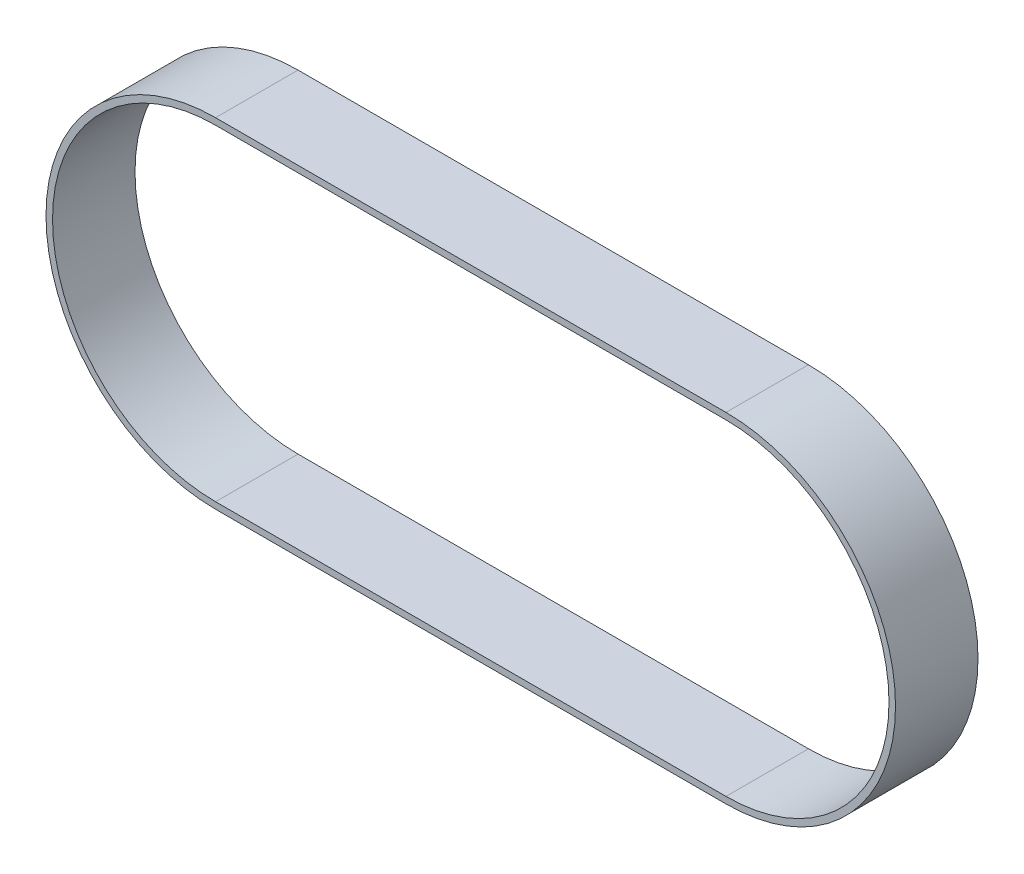
ISO-10303-21;
HEADER;
FILE_DESCRIPTION(('STEP AP214'),'2;1');
FILE_NAME('part.step','',(''),(''),'','','');
FILE_SCHEMA(('AUTOMOTIVE_DESIGN { 1 0 10303 214 1 1 1 1 }'));
ENDSEC;
DATA;
#1=APPLICATION_CONTEXT('core data for automotive mechanical design processes');
#2=APPLICATION_PROTOCOL_DEFINITION('international standard','automotive_design',2000,#1);
#3=PRODUCT_CONTEXT('',#1,'mechanical');
#4=PRODUCT('Part','Part','',(#3));
#5=PRODUCT_RELATED_PRODUCT_CATEGORY('part','',(#4));
#6=PRODUCT_DEFINITION_FORMATION('','',#4);
#7=PRODUCT_DEFINITION_CONTEXT('part definition',#1,'design');
#8=PRODUCT_DEFINITION('design','',#6,#7);
#9=PRODUCT_DEFINITION_SHAPE('','',#8);
#10=(LENGTH_UNIT() NAMED_UNIT(*) SI_UNIT(.MILLI.,.METRE.));
#11=(NAMED_UNIT(*) PLANE_ANGLE_UNIT() SI_UNIT($,.RADIAN.));
#12=(NAMED_UNIT(*) SI_UNIT($,.STERADIAN.) SOLID_ANGLE_UNIT());
#13=UNCERTAINTY_MEASURE_WITH_UNIT(LENGTH_MEASURE(1.E-05),#10,'distance_accuracy_value','');
#14=(GEOMETRIC_REPRESENTATION_CONTEXT(3) GLOBAL_UNCERTAINTY_ASSIGNED_CONTEXT((#13)) GLOBAL_UNIT_ASSIGNED_CONTEXT((#10,
#11,#12)) REPRESENTATION_CONTEXT('',''));
#15=CARTESIAN_POINT('',(0.,0.,0.));
#16=DIRECTION('',(0.,0.,1.));
#17=DIRECTION('',(1.,0.,0.));
#18=AXIS2_PLACEMENT_3D('',#15,#16,#17);
#19=CARTESIAN_POINT('',(-168.807812834292,0.,12.65));
#20=DIRECTION('',(0.,0.,1.));
#21=DIRECTION('',(1.,0.,0.));
#22=AXIS2_PLACEMENT_3D('',#19,#20,#21);
#23=PLANE('',#22);
#24=CARTESIAN_POINT('',(-168.807812834292,0.,12.65));
#25=DIRECTION('',(0.,0.,1.));
#26=DIRECTION('',(1.,0.,0.));
#27=AXIS2_PLACEMENT_3D('',#24,#25,#26);
#28=CIRCLE('',#27,52.);
#29=CARTESIAN_POINT('',(-168.807812834292,52.,12.65));
#30=VERTEX_POINT('',#29);
#31=CARTESIAN_POINT('',(-168.807812834292,-52.,12.65));
#32=VERTEX_POINT('',#31);
#33=EDGE_CURVE('E138',#30,#32,#28,.T.);
#34=ORIENTED_EDGE('',*,*,#33,.T.);
#35=DIRECTION('',(1.,0.,0.));
#36=VECTOR('',#35,1.);
#37=CARTESIAN_POINT('',(-168.807812834292,-52.,12.65));
#38=LINE('',#37,#36);
#39=CARTESIAN_POINT('',(-12.2678128342921,-52.,12.65));
#40=VERTEX_POINT('',#39);
#41=EDGE_CURVE('E141',#32,#40,#38,.T.);
#42=ORIENTED_EDGE('',*,*,#41,.T.);
#43=CARTESIAN_POINT('',(-12.267812834292,0.,12.65));
#44=DIRECTION('',(0.,0.,1.));
#45=DIRECTION('',(1.,0.,0.));
#46=AXIS2_PLACEMENT_3D('',#43,#44,#45);
#47=CIRCLE('',#46,52.);
#48=CARTESIAN_POINT('',(-12.267812834292,52.,12.65));
#49=VERTEX_POINT('',#48);
#50=EDGE_CURVE('E144',#40,#49,#47,.T.);
#51=ORIENTED_EDGE('',*,*,#50,.T.);
#52=DIRECTION('',(-1.,0.,0.));
#53=VECTOR('',#52,1.);
#54=CARTESIAN_POINT('',(-168.807812834292,52.,12.65));
#55=LINE('',#54,#53);
#56=EDGE_CURVE('E146',#49,#30,#55,.T.);
#57=ORIENTED_EDGE('',*,*,#56,.T.);
#58=EDGE_LOOP('',(#34,#42,#51,#57));
#59=FACE_BOUND('',#58,.T.);
#60=DIRECTION('',(1.,0.,0.));
#61=VECTOR('',#60,1.);
#62=CARTESIAN_POINT('',(-168.807812834292,-50.,12.65));
#63=LINE('',#62,#61);
#64=CARTESIAN_POINT('',(-168.807812834292,-50.,12.65));
#65=VERTEX_POINT('',#64);
#66=CARTESIAN_POINT('',(-12.267812834292,-50.,12.65));
#67=VERTEX_POINT('',#66);
#68=EDGE_CURVE('E110',#65,#67,#63,.T.);
#69=ORIENTED_EDGE('',*,*,#68,.F.);
#70=CARTESIAN_POINT('',(-168.807812834292,0.,12.65));
#71=DIRECTION('',(0.,0.,1.));
#72=DIRECTION('',(1.,0.,0.));
#73=AXIS2_PLACEMENT_3D('',#70,#71,#72);
#74=CIRCLE('',#73,50.);
#75=CARTESIAN_POINT('',(-168.807812834292,50.,12.65));
#76=VERTEX_POINT('',#75);
#77=EDGE_CURVE('E102',#76,#65,#74,.T.);
#78=ORIENTED_EDGE('',*,*,#77,.F.);
#79=DIRECTION('',(-1.,0.,0.));
#80=VECTOR('',#79,1.);
#81=CARTESIAN_POINT('',(-168.807812834292,50.,12.65));
#82=LINE('',#81,#80);
#83=CARTESIAN_POINT('',(-12.267812834292,50.,12.65));
#84=VERTEX_POINT('',#83);
#85=EDGE_CURVE('E124',#84,#76,#82,.T.);
#86=ORIENTED_EDGE('',*,*,#85,.F.);
#87=CARTESIAN_POINT('',(-12.267812834292,0.,12.65));
#88=DIRECTION('',(0.,0.,1.));
#89=DIRECTION('',(1.,0.,0.));
#90=AXIS2_PLACEMENT_3D('',#87,#88,#89);
#91=CIRCLE('',#90,50.);
#92=EDGE_CURVE('E122',#67,#84,#91,.T.);
#93=ORIENTED_EDGE('',*,*,#92,.F.);
#94=EDGE_LOOP('',(#69,#78,#86,#93));
#95=FACE_BOUND('',#94,.T.);
#96=ADVANCED_FACE('F37',(#59,#95),#23,.T.);
#97=CARTESIAN_POINT('',(-168.807812834292,0.,-12.65));
#98=DIRECTION('',(0.,0.,1.));
#99=DIRECTION('',(1.,0.,0.));
#100=AXIS2_PLACEMENT_3D('',#97,#98,#99);
#101=PLANE('',#100);
#102=CARTESIAN_POINT('',(-168.807812834292,0.,-12.65));
#103=DIRECTION('',(0.,0.,1.));
#104=DIRECTION('',(1.,0.,0.));
#105=AXIS2_PLACEMENT_3D('',#102,#103,#104);
#106=CIRCLE('',#105,52.);
#107=CARTESIAN_POINT('',(-168.807812834292,52.,-12.65));
#108=VERTEX_POINT('',#107);
#109=CARTESIAN_POINT('',(-168.807812834292,-52.,-12.65));
#110=VERTEX_POINT('',#109);
#111=EDGE_CURVE('E118',#108,#110,#106,.T.);
#112=ORIENTED_EDGE('',*,*,#111,.F.);
#113=DIRECTION('',(-1.,0.,0.));
#114=VECTOR('',#113,1.);
#115=CARTESIAN_POINT('',(-168.807812834292,52.,-12.65));
#116=LINE('',#115,#114);
#117=CARTESIAN_POINT('',(-12.267812834292,52.,-12.65));
#118=VERTEX_POINT('',#117);
#119=EDGE_CURVE('E142',#118,#108,#116,.T.);
#120=ORIENTED_EDGE('',*,*,#119,.F.);
#121=CARTESIAN_POINT('',(-12.267812834292,0.,-12.65));
#122=DIRECTION('',(0.,0.,1.));
#123=DIRECTION('',(1.,0.,0.));
#124=AXIS2_PLACEMENT_3D('',#121,#122,#123);
#125=CIRCLE('',#124,52.);
#126=CARTESIAN_POINT('',(-12.2678128342921,-52.,-12.65));
#127=VERTEX_POINT('',#126);
#128=EDGE_CURVE('E153',#127,#118,#125,.T.);
#129=ORIENTED_EDGE('',*,*,#128,.F.);
#130=DIRECTION('',(1.,0.,0.));
#131=VECTOR('',#130,1.);
#132=CARTESIAN_POINT('',(-168.807812834292,-52.,-12.65));
#133=LINE('',#132,#131);
#134=EDGE_CURVE('E151',#110,#127,#133,.T.);
#135=ORIENTED_EDGE('',*,*,#134,.F.);
#136=EDGE_LOOP('',(#112,#120,#129,#135));
#137=FACE_BOUND('',#136,.T.);
#138=CARTESIAN_POINT('',(-168.807812834292,0.,-12.65));
#139=DIRECTION('',(0.,0.,1.));
#140=DIRECTION('',(1.,0.,0.));
#141=AXIS2_PLACEMENT_3D('',#138,#139,#140);
#142=CIRCLE('',#141,50.);
#143=CARTESIAN_POINT('',(-168.807812834292,50.,-12.65));
#144=VERTEX_POINT('',#143);
#145=CARTESIAN_POINT('',(-168.807812834292,-50.,-12.65));
#146=VERTEX_POINT('',#145);
#147=EDGE_CURVE('E60',#144,#146,#142,.T.);
#148=ORIENTED_EDGE('',*,*,#147,.T.);
#149=DIRECTION('',(1.,0.,0.));
#150=VECTOR('',#149,1.);
#151=CARTESIAN_POINT('',(-168.807812834292,-50.,-12.65));
#152=LINE('',#151,#150);
#153=CARTESIAN_POINT('',(-12.267812834292,-50.,-12.65));
#154=VERTEX_POINT('',#153);
#155=EDGE_CURVE('E117',#146,#154,#152,.T.);
#156=ORIENTED_EDGE('',*,*,#155,.T.);
#157=CARTESIAN_POINT('',(-12.267812834292,0.,-12.65));
#158=DIRECTION('',(0.,0.,1.));
#159=DIRECTION('',(1.,0.,0.));
#160=AXIS2_PLACEMENT_3D('',#157,#158,#159);
#161=CIRCLE('',#160,50.);
#162=CARTESIAN_POINT('',(-12.267812834292,50.,-12.65));
#163=VERTEX_POINT('',#162);
#164=EDGE_CURVE('E130',#154,#163,#161,.T.);
#165=ORIENTED_EDGE('',*,*,#164,.T.);
#166=DIRECTION('',(-1.,0.,0.));
#167=VECTOR('',#166,1.);
#168=CARTESIAN_POINT('',(-168.807812834292,50.,-12.65));
#169=LINE('',#168,#167);
#170=EDGE_CURVE('E111',#163,#144,#169,.T.);
#171=ORIENTED_EDGE('',*,*,#170,.T.);
#172=EDGE_LOOP('',(#148,#156,#165,#171));
#173=FACE_BOUND('',#172,.T.);
#174=ADVANCED_FACE('F171',(#137,#173),#101,.F.);
#175=CARTESIAN_POINT('',(-168.807812834292,0.,12.65));
#176=DIRECTION('',(0.,0.,-1.));
#177=DIRECTION('',(-1.,0.,0.));
#178=AXIS2_PLACEMENT_3D('',#175,#176,#177);
#179=CYLINDRICAL_SURFACE('',#178,52.);
#180=ORIENTED_EDGE('',*,*,#111,.T.);
#181=DIRECTION('',(0.,0.,-1.));
#182=VECTOR('',#181,1.);
#183=CARTESIAN_POINT('',(-168.807812834292,-52.,12.65));
#184=LINE('',#183,#182);
#185=EDGE_CURVE('E11',#32,#110,#184,.T.);
#186=ORIENTED_EDGE('',*,*,#185,.F.);
#187=ORIENTED_EDGE('',*,*,#33,.F.);
#188=DIRECTION('',(0.,0.,-1.));
#189=VECTOR('',#188,1.);
#190=CARTESIAN_POINT('',(-168.807812834292,52.,12.65));
#191=LINE('',#190,#189);
#192=EDGE_CURVE('E148',#30,#108,#191,.T.);
#193=ORIENTED_EDGE('',*,*,#192,.T.);
#194=EDGE_LOOP('',(#180,#186,#187,#193));
#195=FACE_BOUND('',#194,.T.);
#196=ADVANCED_FACE('F39',(#195),#179,.T.);
#197=CARTESIAN_POINT('',(-168.807812834292,-52.,12.65));
#198=DIRECTION('',(0.,1.,0.));
#199=DIRECTION('',(-1.,0.,0.));
#200=AXIS2_PLACEMENT_3D('',#197,#198,#199);
#201=PLANE('',#200);
#202=ORIENTED_EDGE('',*,*,#134,.T.);
#203=DIRECTION('',(0.,0.,-1.));
#204=VECTOR('',#203,1.);
#205=CARTESIAN_POINT('',(-12.2678128342921,-52.,12.65));
#206=LINE('',#205,#204);
#207=EDGE_CURVE('E45',#40,#127,#206,.T.);
#208=ORIENTED_EDGE('',*,*,#207,.F.);
#209=ORIENTED_EDGE('',*,*,#41,.F.);
#210=ORIENTED_EDGE('',*,*,#185,.T.);
#211=EDGE_LOOP('',(#202,#208,#209,#210));
#212=FACE_BOUND('',#211,.T.);
#213=ADVANCED_FACE('F181',(#212),#201,.F.);
#214=CARTESIAN_POINT('',(-12.267812834292,0.,12.65));
#215=DIRECTION('',(0.,0.,-1.));
#216=DIRECTION('',(-1.,0.,0.));
#217=AXIS2_PLACEMENT_3D('',#214,#215,#216);
#218=CYLINDRICAL_SURFACE('',#217,52.);
#219=ORIENTED_EDGE('',*,*,#128,.T.);
#220=DIRECTION('',(0.,0.,-1.));
#221=VECTOR('',#220,1.);
#222=CARTESIAN_POINT('',(-12.267812834292,52.,12.65));
#223=LINE('',#222,#221);
#224=EDGE_CURVE('E158',#49,#118,#223,.T.);
#225=ORIENTED_EDGE('',*,*,#224,.F.);
#226=ORIENTED_EDGE('',*,*,#50,.F.);
#227=ORIENTED_EDGE('',*,*,#207,.T.);
#228=EDGE_LOOP('',(#219,#225,#226,#227));
#229=FACE_BOUND('',#228,.T.);
#230=ADVANCED_FACE('F165',(#229),#218,.T.);
#231=CARTESIAN_POINT('',(-168.807812834292,52.,12.65));
#232=DIRECTION('',(0.,-1.,0.));
#233=DIRECTION('',(1.,0.,0.));
#234=AXIS2_PLACEMENT_3D('',#231,#232,#233);
#235=PLANE('',#234);
#236=ORIENTED_EDGE('',*,*,#119,.T.);
#237=ORIENTED_EDGE('',*,*,#192,.F.);
#238=ORIENTED_EDGE('',*,*,#56,.F.);
#239=ORIENTED_EDGE('',*,*,#224,.T.);
#240=EDGE_LOOP('',(#236,#237,#238,#239));
#241=FACE_BOUND('',#240,.T.);
#242=ADVANCED_FACE('F175',(#241),#235,.F.);
#243=CARTESIAN_POINT('',(-168.807812834292,0.,12.65));
#244=DIRECTION('',(0.,0.,-1.));
#245=DIRECTION('',(-1.,0.,0.));
#246=AXIS2_PLACEMENT_3D('',#243,#244,#245);
#247=CYLINDRICAL_SURFACE('',#246,50.);
#248=ORIENTED_EDGE('',*,*,#147,.F.);
#249=DIRECTION('',(0.,0.,-1.));
#250=VECTOR('',#249,1.);
#251=CARTESIAN_POINT('',(-168.807812834292,50.,12.65));
#252=LINE('',#251,#250);
#253=EDGE_CURVE('E106',#76,#144,#252,.T.);
#254=ORIENTED_EDGE('',*,*,#253,.F.);
#255=ORIENTED_EDGE('',*,*,#77,.T.);
#256=DIRECTION('',(0.,0.,-1.));
#257=VECTOR('',#256,1.);
#258=CARTESIAN_POINT('',(-168.807812834292,-50.,12.65));
#259=LINE('',#258,#257);
#260=EDGE_CURVE('E105',#65,#146,#259,.T.);
#261=ORIENTED_EDGE('',*,*,#260,.T.);
#262=EDGE_LOOP('',(#248,#254,#255,#261));
#263=FACE_BOUND('',#262,.T.);
#264=ADVANCED_FACE('F104',(#263),#247,.F.);
#265=CARTESIAN_POINT('',(-168.807812834292,-50.,12.65));
#266=DIRECTION('',(0.,1.,0.));
#267=DIRECTION('',(-1.,0.,0.));
#268=AXIS2_PLACEMENT_3D('',#265,#266,#267);
#269=PLANE('',#268);
#270=ORIENTED_EDGE('',*,*,#155,.F.);
#271=ORIENTED_EDGE('',*,*,#260,.F.);
#272=ORIENTED_EDGE('',*,*,#68,.T.);
#273=DIRECTION('',(0.,0.,-1.));
#274=VECTOR('',#273,1.);
#275=CARTESIAN_POINT('',(-12.267812834292,-50.,12.65));
#276=LINE('',#275,#274);
#277=EDGE_CURVE('E119',#67,#154,#276,.T.);
#278=ORIENTED_EDGE('',*,*,#277,.T.);
#279=EDGE_LOOP('',(#270,#271,#272,#278));
#280=FACE_BOUND('',#279,.T.);
#281=ADVANCED_FACE('F114',(#280),#269,.T.);
#282=CARTESIAN_POINT('',(-12.267812834292,0.,12.65));
#283=DIRECTION('',(0.,0.,-1.));
#284=DIRECTION('',(-1.,0.,0.));
#285=AXIS2_PLACEMENT_3D('',#282,#283,#284);
#286=CYLINDRICAL_SURFACE('',#285,50.);
#287=ORIENTED_EDGE('',*,*,#164,.F.);
#288=ORIENTED_EDGE('',*,*,#277,.F.);
#289=ORIENTED_EDGE('',*,*,#92,.T.);
#290=DIRECTION('',(0.,0.,-1.));
#291=VECTOR('',#290,1.);
#292=CARTESIAN_POINT('',(-12.267812834292,50.,12.65));
#293=LINE('',#292,#291);
#294=EDGE_CURVE('E52',#84,#163,#293,.T.);
#295=ORIENTED_EDGE('',*,*,#294,.T.);
#296=EDGE_LOOP('',(#287,#288,#289,#295));
#297=FACE_BOUND('',#296,.T.);
#298=ADVANCED_FACE('F204',(#297),#286,.F.);
#299=CARTESIAN_POINT('',(-168.807812834292,50.,12.65));
#300=DIRECTION('',(0.,-1.,0.));
#301=DIRECTION('',(1.,0.,0.));
#302=AXIS2_PLACEMENT_3D('',#299,#300,#301);
#303=PLANE('',#302);
#304=ORIENTED_EDGE('',*,*,#170,.F.);
#305=ORIENTED_EDGE('',*,*,#294,.F.);
#306=ORIENTED_EDGE('',*,*,#85,.T.);
#307=ORIENTED_EDGE('',*,*,#253,.T.);
#308=EDGE_LOOP('',(#304,#305,#306,#307));
#309=FACE_BOUND('',#308,.T.);
#310=ADVANCED_FACE('F208',(#309),#303,.T.);
#311=CLOSED_SHELL('',(#96,#174,#196,#213,#230,#242,#264,#281,#298,#310));
#312=MANIFOLD_SOLID_BREP('B2',#311);
#313=ADVANCED_BREP_SHAPE_REPRESENTATION('',(#18,#312),#14);
#314=SHAPE_DEFINITION_REPRESENTATION(#9,#313);
ENDSEC;
END-ISO-10303-21;
